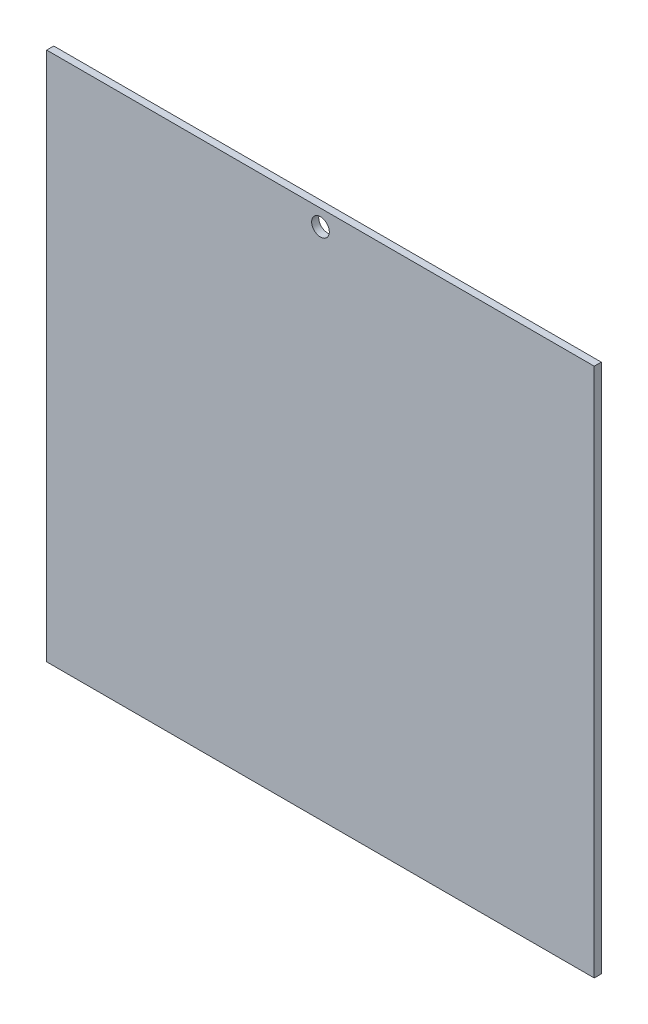
ISO-10303-21;
HEADER;
FILE_DESCRIPTION(('STEP AP214'),'2;1');
FILE_NAME('part.step','',(''),(''),'','','');
FILE_SCHEMA(('AUTOMOTIVE_DESIGN { 1 0 10303 214 1 1 1 1 }'));
ENDSEC;
DATA;
#1=APPLICATION_CONTEXT('core data for automotive mechanical design processes');
#2=APPLICATION_PROTOCOL_DEFINITION('international standard','automotive_design',2000,#1);
#3=PRODUCT_CONTEXT('',#1,'mechanical');
#4=PRODUCT('Part','Part','',(#3));
#5=PRODUCT_RELATED_PRODUCT_CATEGORY('part','',(#4));
#6=PRODUCT_DEFINITION_FORMATION('','',#4);
#7=PRODUCT_DEFINITION_CONTEXT('part definition',#1,'design');
#8=PRODUCT_DEFINITION('design','',#6,#7);
#9=PRODUCT_DEFINITION_SHAPE('','',#8);
#10=(LENGTH_UNIT() NAMED_UNIT(*) SI_UNIT(.MILLI.,.METRE.));
#11=(NAMED_UNIT(*) PLANE_ANGLE_UNIT() SI_UNIT($,.RADIAN.));
#12=(NAMED_UNIT(*) SI_UNIT($,.STERADIAN.) SOLID_ANGLE_UNIT());
#13=UNCERTAINTY_MEASURE_WITH_UNIT(LENGTH_MEASURE(1.E-05),#10,'distance_accuracy_value','');
#14=(GEOMETRIC_REPRESENTATION_CONTEXT(3) GLOBAL_UNCERTAINTY_ASSIGNED_CONTEXT((#13)) GLOBAL_UNIT_ASSIGNED_CONTEXT((#10,
#11,#12)) REPRESENTATION_CONTEXT('',''));
#15=CARTESIAN_POINT('',(0.,0.,0.));
#16=DIRECTION('',(0.,0.,1.));
#17=DIRECTION('',(1.,0.,0.));
#18=AXIS2_PLACEMENT_3D('',#15,#16,#17);
#19=CARTESIAN_POINT('',(155.,150.,4.));
#20=DIRECTION('',(-1.,0.,0.));
#21=DIRECTION('',(0.,-1.,0.));
#22=AXIS2_PLACEMENT_3D('',#19,#20,#21);
#23=PLANE('',#22);
#24=DIRECTION('',(0.,1.,0.));
#25=VECTOR('',#24,1.);
#26=CARTESIAN_POINT('',(155.,150.,0.));
#27=LINE('',#26,#25);
#28=CARTESIAN_POINT('',(155.,-150.,0.));
#29=VERTEX_POINT('',#28);
#30=CARTESIAN_POINT('',(155.,150.,0.));
#31=VERTEX_POINT('',#30);
#32=EDGE_CURVE('E115',#29,#31,#27,.T.);
#33=ORIENTED_EDGE('',*,*,#32,.T.);
#34=DIRECTION('',(0.,0.,-1.));
#35=VECTOR('',#34,1.);
#36=CARTESIAN_POINT('',(155.,150.,4.));
#37=LINE('',#36,#35);
#38=CARTESIAN_POINT('',(155.,150.,4.));
#39=VERTEX_POINT('',#38);
#40=EDGE_CURVE('E11',#39,#31,#37,.T.);
#41=ORIENTED_EDGE('',*,*,#40,.F.);
#42=DIRECTION('',(0.,1.,0.));
#43=VECTOR('',#42,1.);
#44=CARTESIAN_POINT('',(155.,150.,4.));
#45=LINE('',#44,#43);
#46=CARTESIAN_POINT('',(155.,-150.,4.));
#47=VERTEX_POINT('',#46);
#48=EDGE_CURVE('E98',#47,#39,#45,.T.);
#49=ORIENTED_EDGE('',*,*,#48,.F.);
#50=DIRECTION('',(0.,0.,-1.));
#51=VECTOR('',#50,1.);
#52=CARTESIAN_POINT('',(155.,-150.,4.));
#53=LINE('',#52,#51);
#54=EDGE_CURVE('E111',#47,#29,#53,.T.);
#55=ORIENTED_EDGE('',*,*,#54,.T.);
#56=EDGE_LOOP('',(#33,#41,#49,#55));
#57=FACE_BOUND('',#56,.T.);
#58=ADVANCED_FACE('F45',(#57),#23,.F.);
#59=CARTESIAN_POINT('',(-155.,150.,4.));
#60=DIRECTION('',(0.,-1.,0.));
#61=DIRECTION('',(0.,0.,-1.));
#62=AXIS2_PLACEMENT_3D('',#59,#60,#61);
#63=PLANE('',#62);
#64=DIRECTION('',(-1.,0.,0.));
#65=VECTOR('',#64,1.);
#66=CARTESIAN_POINT('',(-155.,150.,0.));
#67=LINE('',#66,#65);
#68=CARTESIAN_POINT('',(-155.,150.,0.));
#69=VERTEX_POINT('',#68);
#70=EDGE_CURVE('E103',#31,#69,#67,.T.);
#71=ORIENTED_EDGE('',*,*,#70,.T.);
#72=DIRECTION('',(0.,0.,-1.));
#73=VECTOR('',#72,1.);
#74=CARTESIAN_POINT('',(-155.,150.,4.));
#75=LINE('',#74,#73);
#76=CARTESIAN_POINT('',(-155.,150.,4.));
#77=VERTEX_POINT('',#76);
#78=EDGE_CURVE('E55',#77,#69,#75,.T.);
#79=ORIENTED_EDGE('',*,*,#78,.F.);
#80=DIRECTION('',(-1.,0.,0.));
#81=VECTOR('',#80,1.);
#82=CARTESIAN_POINT('',(-155.,150.,4.));
#83=LINE('',#82,#81);
#84=EDGE_CURVE('E93',#39,#77,#83,.T.);
#85=ORIENTED_EDGE('',*,*,#84,.F.);
#86=ORIENTED_EDGE('',*,*,#40,.T.);
#87=EDGE_LOOP('',(#71,#79,#85,#86));
#88=FACE_BOUND('',#87,.T.);
#89=ADVANCED_FACE('F102',(#88),#63,.F.);
#90=CARTESIAN_POINT('',(-155.,150.,4.));
#91=DIRECTION('',(1.,0.,0.));
#92=DIRECTION('',(0.,1.,0.));
#93=AXIS2_PLACEMENT_3D('',#90,#91,#92);
#94=PLANE('',#93);
#95=DIRECTION('',(0.,-1.,0.));
#96=VECTOR('',#95,1.);
#97=CARTESIAN_POINT('',(-155.,150.,0.));
#98=LINE('',#97,#96);
#99=CARTESIAN_POINT('',(-155.,-150.,0.));
#100=VERTEX_POINT('',#99);
#101=EDGE_CURVE('E80',#69,#100,#98,.T.);
#102=ORIENTED_EDGE('',*,*,#101,.T.);
#103=DIRECTION('',(0.,0.,-1.));
#104=VECTOR('',#103,1.);
#105=CARTESIAN_POINT('',(-155.,-150.,4.));
#106=LINE('',#105,#104);
#107=CARTESIAN_POINT('',(-155.,-150.,4.));
#108=VERTEX_POINT('',#107);
#109=EDGE_CURVE('E105',#108,#100,#106,.T.);
#110=ORIENTED_EDGE('',*,*,#109,.F.);
#111=DIRECTION('',(0.,-1.,0.));
#112=VECTOR('',#111,1.);
#113=CARTESIAN_POINT('',(-155.,150.,4.));
#114=LINE('',#113,#112);
#115=EDGE_CURVE('E96',#77,#108,#114,.T.);
#116=ORIENTED_EDGE('',*,*,#115,.F.);
#117=ORIENTED_EDGE('',*,*,#78,.T.);
#118=EDGE_LOOP('',(#102,#110,#116,#117));
#119=FACE_BOUND('',#118,.T.);
#120=ADVANCED_FACE('F107',(#119),#94,.F.);
#121=CARTESIAN_POINT('',(-155.,-150.,4.));
#122=DIRECTION('',(0.,1.,0.));
#123=DIRECTION('',(0.,0.,1.));
#124=AXIS2_PLACEMENT_3D('',#121,#122,#123);
#125=PLANE('',#124);
#126=DIRECTION('',(1.,0.,0.));
#127=VECTOR('',#126,1.);
#128=CARTESIAN_POINT('',(-155.,-150.,0.));
#129=LINE('',#128,#127);
#130=EDGE_CURVE('E86',#100,#29,#129,.T.);
#131=ORIENTED_EDGE('',*,*,#130,.T.);
#132=ORIENTED_EDGE('',*,*,#54,.F.);
#133=DIRECTION('',(1.,0.,0.));
#134=VECTOR('',#133,1.);
#135=CARTESIAN_POINT('',(-155.,-150.,4.));
#136=LINE('',#135,#134);
#137=EDGE_CURVE('E63',#108,#47,#136,.T.);
#138=ORIENTED_EDGE('',*,*,#137,.F.);
#139=ORIENTED_EDGE('',*,*,#109,.T.);
#140=EDGE_LOOP('',(#131,#132,#138,#139));
#141=FACE_BOUND('',#140,.T.);
#142=ADVANCED_FACE('F128',(#141),#125,.F.);
#143=CARTESIAN_POINT('',(0.,0.,4.));
#144=DIRECTION('',(0.,0.,1.));
#145=DIRECTION('',(1.,0.,0.));
#146=AXIS2_PLACEMENT_3D('',#143,#144,#145);
#147=PLANE('',#146);
#148=CARTESIAN_POINT('',(0.,140.812034156223,4.));
#149=DIRECTION('',(0.,0.,1.));
#150=DIRECTION('',(1.,0.,0.));
#151=AXIS2_PLACEMENT_3D('',#148,#149,#150);
#152=CIRCLE('',#151,5.);
#153=CARTESIAN_POINT('',(5.,140.812034156223,4.));
#154=VERTEX_POINT('',#153);
#155=EDGE_CURVE('E135',#154,#154,#152,.T.);
#156=ORIENTED_EDGE('',*,*,#155,.F.);
#157=EDGE_LOOP('',(#156));
#158=FACE_BOUND('',#157,.T.);
#159=ORIENTED_EDGE('',*,*,#48,.T.);
#160=ORIENTED_EDGE('',*,*,#84,.T.);
#161=ORIENTED_EDGE('',*,*,#115,.T.);
#162=ORIENTED_EDGE('',*,*,#137,.T.);
#163=EDGE_LOOP('',(#159,#160,#161,#162));
#164=FACE_BOUND('',#163,.T.);
#165=ADVANCED_FACE('F94',(#158,#164),#147,.T.);
#166=CARTESIAN_POINT('',(0.,0.,0.));
#167=DIRECTION('',(0.,0.,1.));
#168=DIRECTION('',(1.,0.,0.));
#169=AXIS2_PLACEMENT_3D('',#166,#167,#168);
#170=PLANE('',#169);
#171=CARTESIAN_POINT('',(0.,140.812034156223,0.));
#172=DIRECTION('',(0.,0.,1.));
#173=DIRECTION('',(1.,0.,0.));
#174=AXIS2_PLACEMENT_3D('',#171,#172,#173);
#175=CIRCLE('',#174,5.);
#176=CARTESIAN_POINT('',(5.,140.812034156223,0.));
#177=VERTEX_POINT('',#176);
#178=EDGE_CURVE('E48',#177,#177,#175,.T.);
#179=ORIENTED_EDGE('',*,*,#178,.T.);
#180=EDGE_LOOP('',(#179));
#181=FACE_BOUND('',#180,.T.);
#182=ORIENTED_EDGE('',*,*,#32,.F.);
#183=ORIENTED_EDGE('',*,*,#130,.F.);
#184=ORIENTED_EDGE('',*,*,#101,.F.);
#185=ORIENTED_EDGE('',*,*,#70,.F.);
#186=EDGE_LOOP('',(#182,#183,#184,#185));
#187=FACE_BOUND('',#186,.T.);
#188=ADVANCED_FACE('F131',(#181,#187),#170,.F.);
#189=CARTESIAN_POINT('',(0.,140.812034156223,-6.));
#190=DIRECTION('',(0.,0.,1.));
#191=DIRECTION('',(1.,0.,0.));
#192=AXIS2_PLACEMENT_3D('',#189,#190,#191);
#193=CYLINDRICAL_SURFACE('',#192,5.);
#194=ORIENTED_EDGE('',*,*,#155,.T.);
#195=EDGE_LOOP('',(#194));
#196=FACE_BOUND('',#195,.T.);
#197=ORIENTED_EDGE('',*,*,#178,.F.);
#198=EDGE_LOOP('',(#197));
#199=FACE_BOUND('',#198,.T.);
#200=ADVANCED_FACE('F145',(#196,#199),#193,.F.);
#201=CLOSED_SHELL('',(#58,#89,#120,#142,#165,#188,#200));
#202=MANIFOLD_SOLID_BREP('B2',#201);
#203=ADVANCED_BREP_SHAPE_REPRESENTATION('',(#18,#202),#14);
#204=SHAPE_DEFINITION_REPRESENTATION(#9,#203);
ENDSEC;
END-ISO-10303-21;
